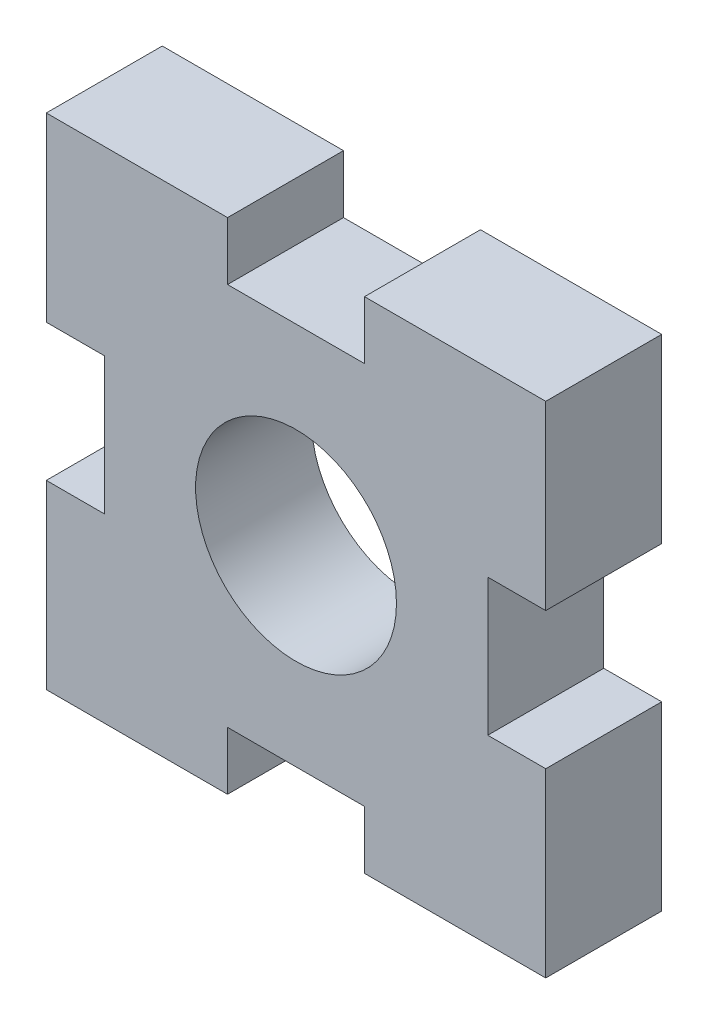
ISO-10303-21;
HEADER;
FILE_DESCRIPTION(('STEP AP214'),'2;1');
FILE_NAME('part.step','',(''),(''),'','','');
FILE_SCHEMA(('AUTOMOTIVE_DESIGN { 1 0 10303 214 1 1 1 1 }'));
ENDSEC;
DATA;
#1=APPLICATION_CONTEXT('core data for automotive mechanical design processes');
#2=APPLICATION_PROTOCOL_DEFINITION('international standard','automotive_design',2000,#1);
#3=PRODUCT_CONTEXT('',#1,'mechanical');
#4=PRODUCT('Part','Part','',(#3));
#5=PRODUCT_RELATED_PRODUCT_CATEGORY('part','',(#4));
#6=PRODUCT_DEFINITION_FORMATION('','',#4);
#7=PRODUCT_DEFINITION_CONTEXT('part definition',#1,'design');
#8=PRODUCT_DEFINITION('design','',#6,#7);
#9=PRODUCT_DEFINITION_SHAPE('','',#8);
#10=(LENGTH_UNIT() NAMED_UNIT(*) SI_UNIT(.MILLI.,.METRE.));
#11=(NAMED_UNIT(*) PLANE_ANGLE_UNIT() SI_UNIT($,.RADIAN.));
#12=(NAMED_UNIT(*) SI_UNIT($,.STERADIAN.) SOLID_ANGLE_UNIT());
#13=UNCERTAINTY_MEASURE_WITH_UNIT(LENGTH_MEASURE(1.E-05),#10,'distance_accuracy_value','');
#14=(GEOMETRIC_REPRESENTATION_CONTEXT(3) GLOBAL_UNCERTAINTY_ASSIGNED_CONTEXT((#13)) GLOBAL_UNIT_ASSIGNED_CONTEXT((#10,
#11,#12)) REPRESENTATION_CONTEXT('',''));
#15=CARTESIAN_POINT('',(0.,0.,0.));
#16=DIRECTION('',(0.,0.,1.));
#17=DIRECTION('',(1.,0.,0.));
#18=AXIS2_PLACEMENT_3D('',#15,#16,#17);
#19=CARTESIAN_POINT('',(-27.35,-27.35,12.7));
#20=DIRECTION('',(1.,0.,0.));
#21=DIRECTION('',(0.,0.,-1.));
#22=AXIS2_PLACEMENT_3D('',#19,#20,#21);
#23=PLANE('',#22);
#24=DIRECTION('',(0.,-1.,0.));
#25=VECTOR('',#24,1.);
#26=CARTESIAN_POINT('',(-27.35,-27.35,12.7));
#27=LINE('',#26,#25);
#28=CARTESIAN_POINT('',(-27.35,-7.5000000000001,12.7));
#29=VERTEX_POINT('',#28);
#30=CARTESIAN_POINT('',(-27.35,-27.35,12.7));
#31=VERTEX_POINT('',#30);
#32=EDGE_CURVE('E342',#29,#31,#27,.T.);
#33=ORIENTED_EDGE('',*,*,#32,.F.);
#34=DIRECTION('',(0.,0.,1.));
#35=VECTOR('',#34,1.);
#36=CARTESIAN_POINT('',(-27.35,-7.5000000000001,0.));
#37=LINE('',#36,#35);
#38=CARTESIAN_POINT('',(-27.35,-7.5000000000001,0.));
#39=VERTEX_POINT('',#38);
#40=EDGE_CURVE('E215',#39,#29,#37,.T.);
#41=ORIENTED_EDGE('',*,*,#40,.F.);
#42=DIRECTION('',(0.,-1.,0.));
#43=VECTOR('',#42,1.);
#44=CARTESIAN_POINT('',(-27.35,-27.35,0.));
#45=LINE('',#44,#43);
#46=CARTESIAN_POINT('',(-27.35,-27.35,0.));
#47=VERTEX_POINT('',#46);
#48=EDGE_CURVE('E200',#39,#47,#45,.T.);
#49=ORIENTED_EDGE('',*,*,#48,.T.);
#50=DIRECTION('',(0.,0.,-1.));
#51=VECTOR('',#50,1.);
#52=CARTESIAN_POINT('',(-27.35,-27.35,12.7));
#53=LINE('',#52,#51);
#54=EDGE_CURVE('E11',#31,#47,#53,.T.);
#55=ORIENTED_EDGE('',*,*,#54,.F.);
#56=EDGE_LOOP('',(#33,#41,#49,#55));
#57=FACE_BOUND('',#56,.T.);
#58=ADVANCED_FACE('F39',(#57),#23,.F.);
#59=CARTESIAN_POINT('',(27.35,-27.35,12.7));
#60=DIRECTION('',(0.,1.,0.));
#61=DIRECTION('',(-1.,0.,0.));
#62=AXIS2_PLACEMENT_3D('',#59,#60,#61);
#63=PLANE('',#62);
#64=DIRECTION('',(1.,0.,0.));
#65=VECTOR('',#64,1.);
#66=CARTESIAN_POINT('',(27.35,-27.35,12.7));
#67=LINE('',#66,#65);
#68=CARTESIAN_POINT('',(7.5,-27.35,12.7));
#69=VERTEX_POINT('',#68);
#70=CARTESIAN_POINT('',(27.35,-27.35,12.7));
#71=VERTEX_POINT('',#70);
#72=EDGE_CURVE('E341',#69,#71,#67,.T.);
#73=ORIENTED_EDGE('',*,*,#72,.F.);
#74=DIRECTION('',(0.,0.,1.));
#75=VECTOR('',#74,1.);
#76=CARTESIAN_POINT('',(7.5,-27.35,0.));
#77=LINE('',#76,#75);
#78=CARTESIAN_POINT('',(7.5,-27.35,0.));
#79=VERTEX_POINT('',#78);
#80=EDGE_CURVE('E212',#79,#69,#77,.T.);
#81=ORIENTED_EDGE('',*,*,#80,.F.);
#82=DIRECTION('',(1.,0.,0.));
#83=VECTOR('',#82,1.);
#84=CARTESIAN_POINT('',(27.35,-27.35,0.));
#85=LINE('',#84,#83);
#86=CARTESIAN_POINT('',(27.35,-27.35,0.));
#87=VERTEX_POINT('',#86);
#88=EDGE_CURVE('E362',#79,#87,#85,.T.);
#89=ORIENTED_EDGE('',*,*,#88,.T.);
#90=DIRECTION('',(0.,0.,-1.));
#91=VECTOR('',#90,1.);
#92=CARTESIAN_POINT('',(27.35,-27.35,12.7));
#93=LINE('',#92,#91);
#94=EDGE_CURVE('E48',#71,#87,#93,.T.);
#95=ORIENTED_EDGE('',*,*,#94,.F.);
#96=EDGE_LOOP('',(#73,#81,#89,#95));
#97=FACE_BOUND('',#96,.T.);
#98=ADVANCED_FACE('F468',(#97),#63,.F.);
#99=CARTESIAN_POINT('',(27.35,-27.35,12.7));
#100=DIRECTION('',(-1.,0.,0.));
#101=DIRECTION('',(0.,0.,1.));
#102=AXIS2_PLACEMENT_3D('',#99,#100,#101);
#103=PLANE('',#102);
#104=DIRECTION('',(0.,1.,0.));
#105=VECTOR('',#104,1.);
#106=CARTESIAN_POINT('',(27.35,-27.35,12.7));
#107=LINE('',#106,#105);
#108=CARTESIAN_POINT('',(27.3499999999999,7.50000000000029,12.7));
#109=VERTEX_POINT('',#108);
#110=CARTESIAN_POINT('',(27.35,27.35,12.7));
#111=VERTEX_POINT('',#110);
#112=EDGE_CURVE('E347',#109,#111,#107,.T.);
#113=ORIENTED_EDGE('',*,*,#112,.F.);
#114=DIRECTION('',(0.,0.,1.));
#115=VECTOR('',#114,1.);
#116=CARTESIAN_POINT('',(27.3499999999999,7.50000000000029,0.));
#117=LINE('',#116,#115);
#118=CARTESIAN_POINT('',(27.3499999999999,7.50000000000029,0.));
#119=VERTEX_POINT('',#118);
#120=EDGE_CURVE('E242',#119,#109,#117,.T.);
#121=ORIENTED_EDGE('',*,*,#120,.F.);
#122=DIRECTION('',(0.,1.,0.));
#123=VECTOR('',#122,1.);
#124=CARTESIAN_POINT('',(27.35,-27.35,0.));
#125=LINE('',#124,#123);
#126=CARTESIAN_POINT('',(27.35,27.35,0.));
#127=VERTEX_POINT('',#126);
#128=EDGE_CURVE('E367',#119,#127,#125,.T.);
#129=ORIENTED_EDGE('',*,*,#128,.T.);
#130=DIRECTION('',(0.,0.,-1.));
#131=VECTOR('',#130,1.);
#132=CARTESIAN_POINT('',(27.35,27.35,12.7));
#133=LINE('',#132,#131);
#134=EDGE_CURVE('E380',#111,#127,#133,.T.);
#135=ORIENTED_EDGE('',*,*,#134,.F.);
#136=EDGE_LOOP('',(#113,#121,#129,#135));
#137=FACE_BOUND('',#136,.T.);
#138=ADVANCED_FACE('F451',(#137),#103,.F.);
#139=CARTESIAN_POINT('',(27.35,27.35,12.7));
#140=DIRECTION('',(0.,-1.,0.));
#141=DIRECTION('',(1.,0.,0.));
#142=AXIS2_PLACEMENT_3D('',#139,#140,#141);
#143=PLANE('',#142);
#144=DIRECTION('',(-1.,0.,0.));
#145=VECTOR('',#144,1.);
#146=CARTESIAN_POINT('',(27.35,27.35,12.7));
#147=LINE('',#146,#145);
#148=CARTESIAN_POINT('',(-7.5,27.35,12.7));
#149=VERTEX_POINT('',#148);
#150=CARTESIAN_POINT('',(-27.35,27.35,12.7));
#151=VERTEX_POINT('',#150);
#152=EDGE_CURVE('E352',#149,#151,#147,.T.);
#153=ORIENTED_EDGE('',*,*,#152,.F.);
#154=DIRECTION('',(0.,0.,1.));
#155=VECTOR('',#154,1.);
#156=CARTESIAN_POINT('',(-7.5,27.35,0.));
#157=LINE('',#156,#155);
#158=CARTESIAN_POINT('',(-7.5,27.35,0.));
#159=VERTEX_POINT('',#158);
#160=EDGE_CURVE('E325',#159,#149,#157,.T.);
#161=ORIENTED_EDGE('',*,*,#160,.F.);
#162=DIRECTION('',(-1.,0.,0.));
#163=VECTOR('',#162,1.);
#164=CARTESIAN_POINT('',(27.35,27.35,0.));
#165=LINE('',#164,#163);
#166=CARTESIAN_POINT('',(-27.35,27.35,0.));
#167=VERTEX_POINT('',#166);
#168=EDGE_CURVE('E372',#159,#167,#165,.T.);
#169=ORIENTED_EDGE('',*,*,#168,.T.);
#170=DIRECTION('',(0.,0.,-1.));
#171=VECTOR('',#170,1.);
#172=CARTESIAN_POINT('',(-27.35,27.35,12.7));
#173=LINE('',#172,#171);
#174=EDGE_CURVE('E357',#151,#167,#173,.T.);
#175=ORIENTED_EDGE('',*,*,#174,.F.);
#176=EDGE_LOOP('',(#153,#161,#169,#175));
#177=FACE_BOUND('',#176,.T.);
#178=ADVANCED_FACE('F432',(#177),#143,.F.);
#179=CARTESIAN_POINT('',(-27.35,7.4999999999999,0.));
#180=VERTEX_POINT('',#179);
#181=EDGE_CURVE('E358',#167,#180,#45,.T.);
#182=ORIENTED_EDGE('',*,*,#181,.T.);
#183=DIRECTION('',(0.,0.,1.));
#184=VECTOR('',#183,1.);
#185=CARTESIAN_POINT('',(-27.35,7.4999999999999,0.));
#186=LINE('',#185,#184);
#187=CARTESIAN_POINT('',(-27.35,7.4999999999999,12.7));
#188=VERTEX_POINT('',#187);
#189=EDGE_CURVE('E219',#180,#188,#186,.T.);
#190=ORIENTED_EDGE('',*,*,#189,.T.);
#191=EDGE_CURVE('E337',#151,#188,#27,.T.);
#192=ORIENTED_EDGE('',*,*,#191,.F.);
#193=ORIENTED_EDGE('',*,*,#174,.T.);
#194=EDGE_LOOP('',(#182,#190,#192,#193));
#195=FACE_BOUND('',#194,.T.);
#196=ADVANCED_FACE('F41',(#195),#23,.F.);
#197=CARTESIAN_POINT('',(-7.5,-27.35,0.));
#198=VERTEX_POINT('',#197);
#199=EDGE_CURVE('E363',#47,#198,#85,.T.);
#200=ORIENTED_EDGE('',*,*,#199,.T.);
#201=DIRECTION('',(0.,0.,1.));
#202=VECTOR('',#201,1.);
#203=CARTESIAN_POINT('',(-7.5,-27.35,0.));
#204=LINE('',#203,#202);
#205=CARTESIAN_POINT('',(-7.5,-27.35,12.7));
#206=VERTEX_POINT('',#205);
#207=EDGE_CURVE('E250',#198,#206,#204,.T.);
#208=ORIENTED_EDGE('',*,*,#207,.T.);
#209=EDGE_CURVE('E343',#31,#206,#67,.T.);
#210=ORIENTED_EDGE('',*,*,#209,.F.);
#211=ORIENTED_EDGE('',*,*,#54,.T.);
#212=EDGE_LOOP('',(#200,#208,#210,#211));
#213=FACE_BOUND('',#212,.T.);
#214=ADVANCED_FACE('F420',(#213),#63,.F.);
#215=CARTESIAN_POINT('',(27.3500000000001,-7.49999999999971,0.));
#216=VERTEX_POINT('',#215);
#217=EDGE_CURVE('E368',#87,#216,#125,.T.);
#218=ORIENTED_EDGE('',*,*,#217,.T.);
#219=DIRECTION('',(0.,0.,1.));
#220=VECTOR('',#219,1.);
#221=CARTESIAN_POINT('',(27.3500000000001,-7.49999999999971,0.));
#222=LINE('',#221,#220);
#223=CARTESIAN_POINT('',(27.3500000000001,-7.49999999999971,12.7));
#224=VERTEX_POINT('',#223);
#225=EDGE_CURVE('E285',#216,#224,#222,.T.);
#226=ORIENTED_EDGE('',*,*,#225,.T.);
#227=EDGE_CURVE('E348',#71,#224,#107,.T.);
#228=ORIENTED_EDGE('',*,*,#227,.F.);
#229=ORIENTED_EDGE('',*,*,#94,.T.);
#230=EDGE_LOOP('',(#218,#226,#228,#229));
#231=FACE_BOUND('',#230,.T.);
#232=ADVANCED_FACE('F389',(#231),#103,.F.);
#233=CARTESIAN_POINT('',(7.5,27.35,0.));
#234=VERTEX_POINT('',#233);
#235=EDGE_CURVE('E373',#127,#234,#165,.T.);
#236=ORIENTED_EDGE('',*,*,#235,.T.);
#237=DIRECTION('',(0.,0.,1.));
#238=VECTOR('',#237,1.);
#239=CARTESIAN_POINT('',(7.5,27.35,0.));
#240=LINE('',#239,#238);
#241=CARTESIAN_POINT('',(7.5,27.35,12.7));
#242=VERTEX_POINT('',#241);
#243=EDGE_CURVE('E328',#234,#242,#240,.T.);
#244=ORIENTED_EDGE('',*,*,#243,.T.);
#245=EDGE_CURVE('E353',#111,#242,#147,.T.);
#246=ORIENTED_EDGE('',*,*,#245,.F.);
#247=ORIENTED_EDGE('',*,*,#134,.T.);
#248=EDGE_LOOP('',(#236,#244,#246,#247));
#249=FACE_BOUND('',#248,.T.);
#250=ADVANCED_FACE('F446',(#249),#143,.F.);
#251=CARTESIAN_POINT('',(0.,0.,12.7));
#252=DIRECTION('',(0.,0.,1.));
#253=DIRECTION('',(1.,0.,0.));
#254=AXIS2_PLACEMENT_3D('',#251,#252,#253);
#255=PLANE('',#254);
#256=DIRECTION('',(1.,0.,0.));
#257=VECTOR('',#256,1.);
#258=CARTESIAN_POINT('',(-27.35,-7.5000000000001,12.7));
#259=LINE('',#258,#257);
#260=CARTESIAN_POINT('',(-21.,-7.50000000000007,12.7));
#261=VERTEX_POINT('',#260);
#262=EDGE_CURVE('E183',#29,#261,#259,.T.);
#263=ORIENTED_EDGE('',*,*,#262,.F.);
#264=ORIENTED_EDGE('',*,*,#32,.T.);
#265=ORIENTED_EDGE('',*,*,#209,.T.);
#266=DIRECTION('',(0.,-1.,0.));
#267=VECTOR('',#266,1.);
#268=CARTESIAN_POINT('',(-7.5,-27.35,12.7));
#269=LINE('',#268,#267);
#270=CARTESIAN_POINT('',(-7.5,-21.,12.7));
#271=VERTEX_POINT('',#270);
#272=EDGE_CURVE('E230',#271,#206,#269,.T.);
#273=ORIENTED_EDGE('',*,*,#272,.F.);
#274=DIRECTION('',(-1.,0.,0.));
#275=VECTOR('',#274,1.);
#276=CARTESIAN_POINT('',(7.5,-21.,12.7));
#277=LINE('',#276,#275);
#278=CARTESIAN_POINT('',(7.5,-21.,12.7));
#279=VERTEX_POINT('',#278);
#280=EDGE_CURVE('E241',#279,#271,#277,.T.);
#281=ORIENTED_EDGE('',*,*,#280,.F.);
#282=DIRECTION('',(0.,1.,0.));
#283=VECTOR('',#282,1.);
#284=CARTESIAN_POINT('',(7.5,-27.35,12.7));
#285=LINE('',#284,#283);
#286=EDGE_CURVE('E237',#69,#279,#285,.T.);
#287=ORIENTED_EDGE('',*,*,#286,.F.);
#288=ORIENTED_EDGE('',*,*,#72,.T.);
#289=ORIENTED_EDGE('',*,*,#227,.T.);
#290=DIRECTION('',(1.,0.,0.));
#291=VECTOR('',#290,1.);
#292=CARTESIAN_POINT('',(27.3500000000001,-7.49999999999971,12.7));
#293=LINE('',#292,#291);
#294=CARTESIAN_POINT('',(21.0000000000001,-7.49999999999978,12.7));
#295=VERTEX_POINT('',#294);
#296=EDGE_CURVE('E264',#295,#224,#293,.T.);
#297=ORIENTED_EDGE('',*,*,#296,.F.);
#298=DIRECTION('',(0.,-1.,0.));
#299=VECTOR('',#298,1.);
#300=CARTESIAN_POINT('',(20.9999999999999,7.50000000000022,12.7));
#301=LINE('',#300,#299);
#302=CARTESIAN_POINT('',(20.9999999999999,7.50000000000022,12.7));
#303=VERTEX_POINT('',#302);
#304=EDGE_CURVE('E277',#303,#295,#301,.T.);
#305=ORIENTED_EDGE('',*,*,#304,.F.);
#306=DIRECTION('',(-1.,0.,0.));
#307=VECTOR('',#306,1.);
#308=CARTESIAN_POINT('',(27.3499999999999,7.50000000000029,12.7));
#309=LINE('',#308,#307);
#310=EDGE_CURVE('E273',#109,#303,#309,.T.);
#311=ORIENTED_EDGE('',*,*,#310,.F.);
#312=ORIENTED_EDGE('',*,*,#112,.T.);
#313=ORIENTED_EDGE('',*,*,#245,.T.);
#314=DIRECTION('',(0.,1.,0.));
#315=VECTOR('',#314,1.);
#316=CARTESIAN_POINT('',(7.5,27.35,12.7));
#317=LINE('',#316,#315);
#318=CARTESIAN_POINT('',(7.5,21.,12.7));
#319=VERTEX_POINT('',#318);
#320=EDGE_CURVE('E307',#319,#242,#317,.T.);
#321=ORIENTED_EDGE('',*,*,#320,.F.);
#322=DIRECTION('',(1.,0.,0.));
#323=VECTOR('',#322,1.);
#324=CARTESIAN_POINT('',(-7.5,21.,12.7));
#325=LINE('',#324,#323);
#326=CARTESIAN_POINT('',(-7.5,21.,12.7));
#327=VERTEX_POINT('',#326);
#328=EDGE_CURVE('E319',#327,#319,#325,.T.);
#329=ORIENTED_EDGE('',*,*,#328,.F.);
#330=DIRECTION('',(0.,-1.,0.));
#331=VECTOR('',#330,1.);
#332=CARTESIAN_POINT('',(-7.5,27.35,12.7));
#333=LINE('',#332,#331);
#334=EDGE_CURVE('E298',#149,#327,#333,.T.);
#335=ORIENTED_EDGE('',*,*,#334,.F.);
#336=ORIENTED_EDGE('',*,*,#152,.T.);
#337=ORIENTED_EDGE('',*,*,#191,.T.);
#338=DIRECTION('',(-1.,0.,0.));
#339=VECTOR('',#338,1.);
#340=CARTESIAN_POINT('',(-27.35,7.4999999999999,12.7));
#341=LINE('',#340,#339);
#342=CARTESIAN_POINT('',(-21.,7.49999999999993,12.7));
#343=VERTEX_POINT('',#342);
#344=EDGE_CURVE('E202',#343,#188,#341,.T.);
#345=ORIENTED_EDGE('',*,*,#344,.F.);
#346=DIRECTION('',(0.,1.,0.));
#347=VECTOR('',#346,1.);
#348=CARTESIAN_POINT('',(-21.,-7.50000000000007,12.7));
#349=LINE('',#348,#347);
#350=EDGE_CURVE('E205',#261,#343,#349,.T.);
#351=ORIENTED_EDGE('',*,*,#350,.F.);
#352=EDGE_LOOP('',(#263,#264,#265,#273,#281,#287,#288,#289,#297,#305,#311,#312,#313,#321,#329,
#335,#336,#337,#345,#351));
#353=FACE_BOUND('',#352,.T.);
#354=CARTESIAN_POINT('',(0.,0.,12.7));
#355=DIRECTION('',(0.,0.,1.));
#356=DIRECTION('',(1.,0.,0.));
#357=AXIS2_PLACEMENT_3D('',#354,#355,#356);
#358=CIRCLE('',#357,11.);
#359=CARTESIAN_POINT('',(11.,0.,12.7));
#360=VERTEX_POINT('',#359);
#361=EDGE_CURVE('E218',#360,#360,#358,.T.);
#362=ORIENTED_EDGE('',*,*,#361,.F.);
#363=EDGE_LOOP('',(#362));
#364=FACE_BOUND('',#363,.T.);
#365=ADVANCED_FACE('F403',(#353,#364),#255,.T.);
#366=CARTESIAN_POINT('',(0.,0.,0.));
#367=DIRECTION('',(0.,0.,1.));
#368=DIRECTION('',(1.,0.,0.));
#369=AXIS2_PLACEMENT_3D('',#366,#367,#368);
#370=PLANE('',#369);
#371=ORIENTED_EDGE('',*,*,#48,.F.);
#372=DIRECTION('',(1.,0.,0.));
#373=VECTOR('',#372,1.);
#374=CARTESIAN_POINT('',(-27.35,-7.5000000000001,0.));
#375=LINE('',#374,#373);
#376=CARTESIAN_POINT('',(-21.,-7.50000000000007,0.));
#377=VERTEX_POINT('',#376);
#378=EDGE_CURVE('E180',#39,#377,#375,.T.);
#379=ORIENTED_EDGE('',*,*,#378,.T.);
#380=DIRECTION('',(0.,1.,0.));
#381=VECTOR('',#380,1.);
#382=CARTESIAN_POINT('',(-21.,-7.50000000000007,0.));
#383=LINE('',#382,#381);
#384=CARTESIAN_POINT('',(-21.,7.49999999999993,0.));
#385=VERTEX_POINT('',#384);
#386=EDGE_CURVE('E191',#377,#385,#383,.T.);
#387=ORIENTED_EDGE('',*,*,#386,.T.);
#388=DIRECTION('',(-1.,0.,0.));
#389=VECTOR('',#388,1.);
#390=CARTESIAN_POINT('',(-27.35,7.4999999999999,0.));
#391=LINE('',#390,#389);
#392=EDGE_CURVE('E55',#385,#180,#391,.T.);
#393=ORIENTED_EDGE('',*,*,#392,.T.);
#394=ORIENTED_EDGE('',*,*,#181,.F.);
#395=ORIENTED_EDGE('',*,*,#168,.F.);
#396=DIRECTION('',(0.,-1.,0.));
#397=VECTOR('',#396,1.);
#398=CARTESIAN_POINT('',(-7.5,27.35,0.));
#399=LINE('',#398,#397);
#400=CARTESIAN_POINT('',(-7.5,21.,0.));
#401=VERTEX_POINT('',#400);
#402=EDGE_CURVE('E302',#159,#401,#399,.T.);
#403=ORIENTED_EDGE('',*,*,#402,.T.);
#404=DIRECTION('',(1.,0.,0.));
#405=VECTOR('',#404,1.);
#406=CARTESIAN_POINT('',(-7.5,21.,0.));
#407=LINE('',#406,#405);
#408=CARTESIAN_POINT('',(7.5,21.,0.));
#409=VERTEX_POINT('',#408);
#410=EDGE_CURVE('E306',#401,#409,#407,.T.);
#411=ORIENTED_EDGE('',*,*,#410,.T.);
#412=DIRECTION('',(0.,1.,0.));
#413=VECTOR('',#412,1.);
#414=CARTESIAN_POINT('',(7.5,27.35,0.));
#415=LINE('',#414,#413);
#416=EDGE_CURVE('E311',#409,#234,#415,.T.);
#417=ORIENTED_EDGE('',*,*,#416,.T.);
#418=ORIENTED_EDGE('',*,*,#235,.F.);
#419=ORIENTED_EDGE('',*,*,#128,.F.);
#420=DIRECTION('',(-1.,0.,0.));
#421=VECTOR('',#420,1.);
#422=CARTESIAN_POINT('',(27.3499999999999,7.50000000000029,0.));
#423=LINE('',#422,#421);
#424=CARTESIAN_POINT('',(20.9999999999999,7.50000000000022,0.));
#425=VERTEX_POINT('',#424);
#426=EDGE_CURVE('E259',#119,#425,#423,.T.);
#427=ORIENTED_EDGE('',*,*,#426,.T.);
#428=DIRECTION('',(0.,-1.,0.));
#429=VECTOR('',#428,1.);
#430=CARTESIAN_POINT('',(20.9999999999999,7.50000000000022,0.));
#431=LINE('',#430,#429);
#432=CARTESIAN_POINT('',(21.0000000000001,-7.49999999999978,0.));
#433=VERTEX_POINT('',#432);
#434=EDGE_CURVE('E263',#425,#433,#431,.T.);
#435=ORIENTED_EDGE('',*,*,#434,.T.);
#436=DIRECTION('',(1.,0.,0.));
#437=VECTOR('',#436,1.);
#438=CARTESIAN_POINT('',(27.3500000000001,-7.49999999999971,0.));
#439=LINE('',#438,#437);
#440=EDGE_CURVE('E268',#433,#216,#439,.T.);
#441=ORIENTED_EDGE('',*,*,#440,.T.);
#442=ORIENTED_EDGE('',*,*,#217,.F.);
#443=ORIENTED_EDGE('',*,*,#88,.F.);
#444=DIRECTION('',(0.,1.,0.));
#445=VECTOR('',#444,1.);
#446=CARTESIAN_POINT('',(7.5,-27.35,0.));
#447=LINE('',#446,#445);
#448=CARTESIAN_POINT('',(7.5,-21.,0.));
#449=VERTEX_POINT('',#448);
#450=EDGE_CURVE('E225',#79,#449,#447,.T.);
#451=ORIENTED_EDGE('',*,*,#450,.T.);
#452=DIRECTION('',(-1.,0.,0.));
#453=VECTOR('',#452,1.);
#454=CARTESIAN_POINT('',(7.5,-21.,0.));
#455=LINE('',#454,#453);
#456=CARTESIAN_POINT('',(-7.5,-21.,0.));
#457=VERTEX_POINT('',#456);
#458=EDGE_CURVE('E229',#449,#457,#455,.T.);
#459=ORIENTED_EDGE('',*,*,#458,.T.);
#460=DIRECTION('',(0.,-1.,0.));
#461=VECTOR('',#460,1.);
#462=CARTESIAN_POINT('',(-7.5,-27.35,0.));
#463=LINE('',#462,#461);
#464=EDGE_CURVE('E63',#457,#198,#463,.T.);
#465=ORIENTED_EDGE('',*,*,#464,.T.);
#466=ORIENTED_EDGE('',*,*,#199,.F.);
#467=EDGE_LOOP('',(#371,#379,#387,#393,#394,#395,#403,#411,#417,#418,#419,#427,#435,#441,#442,
#443,#451,#459,#465,#466));
#468=FACE_BOUND('',#467,.T.);
#469=CARTESIAN_POINT('',(0.,0.,0.));
#470=DIRECTION('',(0.,0.,1.));
#471=DIRECTION('',(1.,0.,0.));
#472=AXIS2_PLACEMENT_3D('',#469,#470,#471);
#473=CIRCLE('',#472,11.);
#474=CARTESIAN_POINT('',(11.,0.,0.));
#475=VERTEX_POINT('',#474);
#476=EDGE_CURVE('E294',#475,#475,#473,.T.);
#477=ORIENTED_EDGE('',*,*,#476,.T.);
#478=EDGE_LOOP('',(#477));
#479=FACE_BOUND('',#478,.T.);
#480=ADVANCED_FACE('F197',(#468,#479),#370,.F.);
#481=CARTESIAN_POINT('',(-7.5,27.35,0.));
#482=DIRECTION('',(-1.,0.,0.));
#483=DIRECTION('',(0.,-1.,0.));
#484=AXIS2_PLACEMENT_3D('',#481,#482,#483);
#485=PLANE('',#484);
#486=ORIENTED_EDGE('',*,*,#334,.T.);
#487=DIRECTION('',(0.,0.,1.));
#488=VECTOR('',#487,1.);
#489=CARTESIAN_POINT('',(-7.5,21.,0.));
#490=LINE('',#489,#488);
#491=EDGE_CURVE('E315',#401,#327,#490,.T.);
#492=ORIENTED_EDGE('',*,*,#491,.F.);
#493=ORIENTED_EDGE('',*,*,#402,.F.);
#494=ORIENTED_EDGE('',*,*,#160,.T.);
#495=EDGE_LOOP('',(#486,#492,#493,#494));
#496=FACE_BOUND('',#495,.T.);
#497=ADVANCED_FACE('F435',(#496),#485,.F.);
#498=CARTESIAN_POINT('',(7.5,27.35,0.));
#499=DIRECTION('',(1.,0.,0.));
#500=DIRECTION('',(0.,1.,0.));
#501=AXIS2_PLACEMENT_3D('',#498,#499,#500);
#502=PLANE('',#501);
#503=ORIENTED_EDGE('',*,*,#320,.T.);
#504=ORIENTED_EDGE('',*,*,#243,.F.);
#505=ORIENTED_EDGE('',*,*,#416,.F.);
#506=DIRECTION('',(0.,0.,1.));
#507=VECTOR('',#506,1.);
#508=CARTESIAN_POINT('',(7.5,21.,0.));
#509=LINE('',#508,#507);
#510=EDGE_CURVE('E332',#409,#319,#509,.T.);
#511=ORIENTED_EDGE('',*,*,#510,.T.);
#512=EDGE_LOOP('',(#503,#504,#505,#511));
#513=FACE_BOUND('',#512,.T.);
#514=ADVANCED_FACE('F532',(#513),#502,.F.);
#515=CARTESIAN_POINT('',(-7.5,21.,0.));
#516=DIRECTION('',(0.,-1.,0.));
#517=DIRECTION('',(1.,0.,0.));
#518=AXIS2_PLACEMENT_3D('',#515,#516,#517);
#519=PLANE('',#518);
#520=ORIENTED_EDGE('',*,*,#328,.T.);
#521=ORIENTED_EDGE('',*,*,#510,.F.);
#522=ORIENTED_EDGE('',*,*,#410,.F.);
#523=ORIENTED_EDGE('',*,*,#491,.T.);
#524=EDGE_LOOP('',(#520,#521,#522,#523));
#525=FACE_BOUND('',#524,.T.);
#526=ADVANCED_FACE('F440',(#525),#519,.F.);
#527=CARTESIAN_POINT('',(0.,0.,0.));
#528=DIRECTION('',(0.,0.,1.));
#529=DIRECTION('',(1.,0.,0.));
#530=AXIS2_PLACEMENT_3D('',#527,#528,#529);
#531=CYLINDRICAL_SURFACE('',#530,11.);
#532=ORIENTED_EDGE('',*,*,#476,.F.);
#533=EDGE_LOOP('',(#532));
#534=FACE_BOUND('',#533,.T.);
#535=ORIENTED_EDGE('',*,*,#361,.T.);
#536=EDGE_LOOP('',(#535));
#537=FACE_BOUND('',#536,.T.);
#538=ADVANCED_FACE('F457',(#534,#537),#531,.F.);
#539=CARTESIAN_POINT('',(27.3499999999999,7.50000000000029,0.));
#540=DIRECTION('',(0.,1.,0.));
#541=DIRECTION('',(-1.,0.,0.));
#542=AXIS2_PLACEMENT_3D('',#539,#540,#541);
#543=PLANE('',#542);
#544=ORIENTED_EDGE('',*,*,#310,.T.);
#545=DIRECTION('',(0.,0.,1.));
#546=VECTOR('',#545,1.);
#547=CARTESIAN_POINT('',(20.9999999999999,7.50000000000022,0.));
#548=LINE('',#547,#546);
#549=EDGE_CURVE('E272',#425,#303,#548,.T.);
#550=ORIENTED_EDGE('',*,*,#549,.F.);
#551=ORIENTED_EDGE('',*,*,#426,.F.);
#552=ORIENTED_EDGE('',*,*,#120,.T.);
#553=EDGE_LOOP('',(#544,#550,#551,#552));
#554=FACE_BOUND('',#553,.T.);
#555=ADVANCED_FACE('F454',(#554),#543,.F.);
#556=CARTESIAN_POINT('',(27.3500000000001,-7.49999999999971,0.));
#557=DIRECTION('',(0.,-1.,0.));
#558=DIRECTION('',(1.,0.,0.));
#559=AXIS2_PLACEMENT_3D('',#556,#557,#558);
#560=PLANE('',#559);
#561=ORIENTED_EDGE('',*,*,#296,.T.);
#562=ORIENTED_EDGE('',*,*,#225,.F.);
#563=ORIENTED_EDGE('',*,*,#440,.F.);
#564=DIRECTION('',(0.,0.,1.));
#565=VECTOR('',#564,1.);
#566=CARTESIAN_POINT('',(21.0000000000001,-7.49999999999978,0.));
#567=LINE('',#566,#565);
#568=EDGE_CURVE('E289',#433,#295,#567,.T.);
#569=ORIENTED_EDGE('',*,*,#568,.T.);
#570=EDGE_LOOP('',(#561,#562,#563,#569));
#571=FACE_BOUND('',#570,.T.);
#572=ADVANCED_FACE('F396',(#571),#560,.F.);
#573=CARTESIAN_POINT('',(20.9999999999999,7.50000000000022,0.));
#574=DIRECTION('',(-1.,0.,0.));
#575=DIRECTION('',(0.,-1.,0.));
#576=AXIS2_PLACEMENT_3D('',#573,#574,#575);
#577=PLANE('',#576);
#578=ORIENTED_EDGE('',*,*,#304,.T.);
#579=ORIENTED_EDGE('',*,*,#568,.F.);
#580=ORIENTED_EDGE('',*,*,#434,.F.);
#581=ORIENTED_EDGE('',*,*,#549,.T.);
#582=EDGE_LOOP('',(#578,#579,#580,#581));
#583=FACE_BOUND('',#582,.T.);
#584=ADVANCED_FACE('F398',(#583),#577,.F.);
#585=CARTESIAN_POINT('',(7.5,-27.35,0.));
#586=DIRECTION('',(1.,0.,0.));
#587=DIRECTION('',(0.,1.,0.));
#588=AXIS2_PLACEMENT_3D('',#585,#586,#587);
#589=PLANE('',#588);
#590=ORIENTED_EDGE('',*,*,#286,.T.);
#591=DIRECTION('',(0.,0.,1.));
#592=VECTOR('',#591,1.);
#593=CARTESIAN_POINT('',(7.5,-21.,0.));
#594=LINE('',#593,#592);
#595=EDGE_CURVE('E236',#449,#279,#594,.T.);
#596=ORIENTED_EDGE('',*,*,#595,.F.);
#597=ORIENTED_EDGE('',*,*,#450,.F.);
#598=ORIENTED_EDGE('',*,*,#80,.T.);
#599=EDGE_LOOP('',(#590,#596,#597,#598));
#600=FACE_BOUND('',#599,.T.);
#601=ADVANCED_FACE('F586',(#600),#589,.F.);
#602=CARTESIAN_POINT('',(-7.5,-27.35,0.));
#603=DIRECTION('',(-1.,0.,0.));
#604=DIRECTION('',(0.,-1.,0.));
#605=AXIS2_PLACEMENT_3D('',#602,#603,#604);
#606=PLANE('',#605);
#607=ORIENTED_EDGE('',*,*,#272,.T.);
#608=ORIENTED_EDGE('',*,*,#207,.F.);
#609=ORIENTED_EDGE('',*,*,#464,.F.);
#610=DIRECTION('',(0.,0.,1.));
#611=VECTOR('',#610,1.);
#612=CARTESIAN_POINT('',(-7.5,-21.,0.));
#613=LINE('',#612,#611);
#614=EDGE_CURVE('E254',#457,#271,#613,.T.);
#615=ORIENTED_EDGE('',*,*,#614,.T.);
#616=EDGE_LOOP('',(#607,#608,#609,#615));
#617=FACE_BOUND('',#616,.T.);
#618=ADVANCED_FACE('F594',(#617),#606,.F.);
#619=CARTESIAN_POINT('',(7.5,-21.,0.));
#620=DIRECTION('',(0.,1.,0.));
#621=DIRECTION('',(-1.,0.,0.));
#622=AXIS2_PLACEMENT_3D('',#619,#620,#621);
#623=PLANE('',#622);
#624=ORIENTED_EDGE('',*,*,#280,.T.);
#625=ORIENTED_EDGE('',*,*,#614,.F.);
#626=ORIENTED_EDGE('',*,*,#458,.F.);
#627=ORIENTED_EDGE('',*,*,#595,.T.);
#628=EDGE_LOOP('',(#624,#625,#626,#627));
#629=FACE_BOUND('',#628,.T.);
#630=ADVANCED_FACE('F604',(#629),#623,.F.);
#631=CARTESIAN_POINT('',(-27.35,-7.5000000000001,0.));
#632=DIRECTION('',(0.,-1.,0.));
#633=DIRECTION('',(1.,0.,0.));
#634=AXIS2_PLACEMENT_3D('',#631,#632,#633);
#635=PLANE('',#634);
#636=ORIENTED_EDGE('',*,*,#262,.T.);
#637=DIRECTION('',(0.,0.,1.));
#638=VECTOR('',#637,1.);
#639=CARTESIAN_POINT('',(-21.,-7.50000000000007,0.));
#640=LINE('',#639,#638);
#641=EDGE_CURVE('E176',#377,#261,#640,.T.);
#642=ORIENTED_EDGE('',*,*,#641,.F.);
#643=ORIENTED_EDGE('',*,*,#378,.F.);
#644=ORIENTED_EDGE('',*,*,#40,.T.);
#645=EDGE_LOOP('',(#636,#642,#643,#644));
#646=FACE_BOUND('',#645,.T.);
#647=ADVANCED_FACE('F178',(#646),#635,.F.);
#648=CARTESIAN_POINT('',(-27.35,7.4999999999999,0.));
#649=DIRECTION('',(0.,1.,0.));
#650=DIRECTION('',(-1.,0.,0.));
#651=AXIS2_PLACEMENT_3D('',#648,#649,#650);
#652=PLANE('',#651);
#653=ORIENTED_EDGE('',*,*,#344,.T.);
#654=ORIENTED_EDGE('',*,*,#189,.F.);
#655=ORIENTED_EDGE('',*,*,#392,.F.);
#656=DIRECTION('',(0.,0.,1.));
#657=VECTOR('',#656,1.);
#658=CARTESIAN_POINT('',(-21.,7.49999999999993,0.));
#659=LINE('',#658,#657);
#660=EDGE_CURVE('E188',#385,#343,#659,.T.);
#661=ORIENTED_EDGE('',*,*,#660,.T.);
#662=EDGE_LOOP('',(#653,#654,#655,#661));
#663=FACE_BOUND('',#662,.T.);
#664=ADVANCED_FACE('F424',(#663),#652,.F.);
#665=CARTESIAN_POINT('',(-21.,-7.50000000000007,0.));
#666=DIRECTION('',(1.,0.,0.));
#667=DIRECTION('',(0.,1.,0.));
#668=AXIS2_PLACEMENT_3D('',#665,#666,#667);
#669=PLANE('',#668);
#670=ORIENTED_EDGE('',*,*,#350,.T.);
#671=ORIENTED_EDGE('',*,*,#660,.F.);
#672=ORIENTED_EDGE('',*,*,#386,.F.);
#673=ORIENTED_EDGE('',*,*,#641,.T.);
#674=EDGE_LOOP('',(#670,#671,#672,#673));
#675=FACE_BOUND('',#674,.T.);
#676=ADVANCED_FACE('F192',(#675),#669,.F.);
#677=CLOSED_SHELL('',(#58,#98,#138,#178,#196,#214,#232,#250,#365,#480,#497,#514,#526,#538,#555,
#572,#584,#601,#618,#630,#647,#664,#676));
#678=MANIFOLD_SOLID_BREP('B2',#677);
#679=ADVANCED_BREP_SHAPE_REPRESENTATION('',(#18,#678),#14);
#680=SHAPE_DEFINITION_REPRESENTATION(#9,#679);
ENDSEC;
END-ISO-10303-21;
